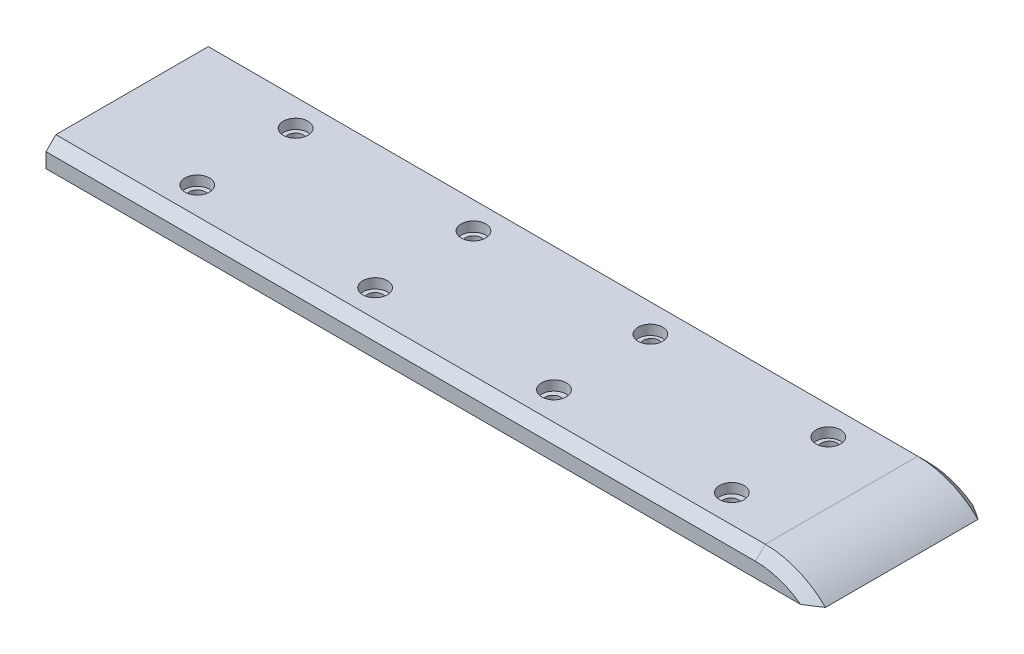
ISO-10303-21;
HEADER;
FILE_DESCRIPTION(('STEP AP214'),'2;1');
FILE_NAME('part.step','',(''),(''),'','','');
FILE_SCHEMA(('AUTOMOTIVE_DESIGN { 1 0 10303 214 1 1 1 1 }'));
ENDSEC;
DATA;
#1=APPLICATION_CONTEXT('core data for automotive mechanical design processes');
#2=APPLICATION_PROTOCOL_DEFINITION('international standard','automotive_design',2000,#1);
#3=PRODUCT_CONTEXT('',#1,'mechanical');
#4=PRODUCT('Part','Part','',(#3));
#5=PRODUCT_RELATED_PRODUCT_CATEGORY('part','',(#4));
#6=PRODUCT_DEFINITION_FORMATION('','',#4);
#7=PRODUCT_DEFINITION_CONTEXT('part definition',#1,'design');
#8=PRODUCT_DEFINITION('design','',#6,#7);
#9=PRODUCT_DEFINITION_SHAPE('','',#8);
#10=(LENGTH_UNIT() NAMED_UNIT(*) SI_UNIT(.MILLI.,.METRE.));
#11=(NAMED_UNIT(*) PLANE_ANGLE_UNIT() SI_UNIT($,.RADIAN.));
#12=(NAMED_UNIT(*) SI_UNIT($,.STERADIAN.) SOLID_ANGLE_UNIT());
#13=UNCERTAINTY_MEASURE_WITH_UNIT(LENGTH_MEASURE(1.E-05),#10,'distance_accuracy_value','');
#14=(GEOMETRIC_REPRESENTATION_CONTEXT(3) GLOBAL_UNCERTAINTY_ASSIGNED_CONTEXT((#13)) GLOBAL_UNIT_ASSIGNED_CONTEXT((#10,
#11,#12)) REPRESENTATION_CONTEXT('',''));
#15=CARTESIAN_POINT('',(0.,0.,0.));
#16=DIRECTION('',(0.,0.,1.));
#17=DIRECTION('',(1.,0.,0.));
#18=AXIS2_PLACEMENT_3D('',#15,#16,#17);
#19=CARTESIAN_POINT('',(62.5000000000001,22.0961940777126,10.));
#20=DIRECTION('',(0.,-1.,0.));
#21=DIRECTION('',(1.,0.,0.));
#22=AXIS2_PLACEMENT_3D('',#19,#20,#21);
#23=CYLINDRICAL_SURFACE('',#22,1.625);
#24=CARTESIAN_POINT('',(62.5000000000001,12.5,10.));
#25=DIRECTION('',(0.,1.,0.));
#26=DIRECTION('',(1.,0.,0.));
#27=AXIS2_PLACEMENT_3D('',#24,#25,#26);
#28=CIRCLE('',#27,1.625);
#29=CARTESIAN_POINT('',(64.1250000000001,12.5,10.));
#30=VERTEX_POINT('',#29);
#31=EDGE_CURVE('E155',#30,#30,#28,.T.);
#32=ORIENTED_EDGE('',*,*,#31,.F.);
#33=EDGE_LOOP('',(#32));
#34=FACE_BOUND('',#33,.T.);
#35=CARTESIAN_POINT('',(62.5000000000001,15.5,10.));
#36=DIRECTION('',(0.,1.,0.));
#37=DIRECTION('',(-1.,0.,0.));
#38=AXIS2_PLACEMENT_3D('',#35,#36,#37);
#39=CIRCLE('',#38,1.625);
#40=CARTESIAN_POINT('',(60.8750000000001,15.5,10.));
#41=VERTEX_POINT('',#40);
#42=EDGE_CURVE('E152',#41,#41,#39,.T.);
#43=ORIENTED_EDGE('',*,*,#42,.T.);
#44=EDGE_LOOP('',(#43));
#45=FACE_BOUND('',#44,.T.);
#46=ADVANCED_FACE('F37',(#34,#45),#23,.F.);
#47=CARTESIAN_POINT('',(26.3333333333334,22.0961940777126,9.99999999999997));
#48=DIRECTION('',(0.,-1.,0.));
#49=DIRECTION('',(1.,0.,0.));
#50=AXIS2_PLACEMENT_3D('',#47,#48,#49);
#51=CYLINDRICAL_SURFACE('',#50,1.625);
#52=CARTESIAN_POINT('',(26.3333333333334,12.5,9.99999999999997));
#53=DIRECTION('',(0.,1.,0.));
#54=DIRECTION('',(1.,0.,0.));
#55=AXIS2_PLACEMENT_3D('',#52,#53,#54);
#56=CIRCLE('',#55,1.625);
#57=CARTESIAN_POINT('',(27.9583333333334,12.5,9.99999999999997));
#58=VERTEX_POINT('',#57);
#59=EDGE_CURVE('E374',#58,#58,#56,.T.);
#60=ORIENTED_EDGE('',*,*,#59,.F.);
#61=EDGE_LOOP('',(#60));
#62=FACE_BOUND('',#61,.T.);
#63=CARTESIAN_POINT('',(26.3333333333334,15.5,9.99999999999997));
#64=DIRECTION('',(0.,1.,0.));
#65=DIRECTION('',(-1.,0.,0.));
#66=AXIS2_PLACEMENT_3D('',#63,#64,#65);
#67=CIRCLE('',#66,1.625);
#68=CARTESIAN_POINT('',(24.7083333333334,15.5,9.99999999999997));
#69=VERTEX_POINT('',#68);
#70=EDGE_CURVE('E149',#69,#69,#67,.T.);
#71=ORIENTED_EDGE('',*,*,#70,.T.);
#72=EDGE_LOOP('',(#71));
#73=FACE_BOUND('',#72,.T.);
#74=ADVANCED_FACE('F213',(#62,#73),#51,.F.);
#75=CARTESIAN_POINT('',(-9.83333333333332,22.0961940777126,10.));
#76=DIRECTION('',(0.,-1.,0.));
#77=DIRECTION('',(1.,0.,0.));
#78=AXIS2_PLACEMENT_3D('',#75,#76,#77);
#79=CYLINDRICAL_SURFACE('',#78,1.625);
#80=CARTESIAN_POINT('',(-9.83333333333332,12.5,10.));
#81=DIRECTION('',(0.,1.,0.));
#82=DIRECTION('',(1.,0.,0.));
#83=AXIS2_PLACEMENT_3D('',#80,#81,#82);
#84=CIRCLE('',#83,1.625);
#85=CARTESIAN_POINT('',(-8.20833333333332,12.5,10.));
#86=VERTEX_POINT('',#85);
#87=EDGE_CURVE('E377',#86,#86,#84,.T.);
#88=ORIENTED_EDGE('',*,*,#87,.F.);
#89=EDGE_LOOP('',(#88));
#90=FACE_BOUND('',#89,.T.);
#91=CARTESIAN_POINT('',(-9.83333333333332,15.5,10.));
#92=DIRECTION('',(0.,1.,0.));
#93=DIRECTION('',(-1.,0.,0.));
#94=AXIS2_PLACEMENT_3D('',#91,#92,#93);
#95=CIRCLE('',#94,1.625);
#96=CARTESIAN_POINT('',(-11.4583333333333,15.5,10.));
#97=VERTEX_POINT('',#96);
#98=EDGE_CURVE('E145',#97,#97,#95,.T.);
#99=ORIENTED_EDGE('',*,*,#98,.T.);
#100=EDGE_LOOP('',(#99));
#101=FACE_BOUND('',#100,.T.);
#102=ADVANCED_FACE('F219',(#90,#101),#79,.F.);
#103=CARTESIAN_POINT('',(-46.,22.0961940777126,10.));
#104=DIRECTION('',(0.,-1.,0.));
#105=DIRECTION('',(1.,0.,0.));
#106=AXIS2_PLACEMENT_3D('',#103,#104,#105);
#107=CYLINDRICAL_SURFACE('',#106,1.625);
#108=CARTESIAN_POINT('',(-46.,12.5,10.));
#109=DIRECTION('',(0.,1.,0.));
#110=DIRECTION('',(1.,0.,0.));
#111=AXIS2_PLACEMENT_3D('',#108,#109,#110);
#112=CIRCLE('',#111,1.625);
#113=CARTESIAN_POINT('',(-44.375,12.5,10.));
#114=VERTEX_POINT('',#113);
#115=EDGE_CURVE('E358',#114,#114,#112,.T.);
#116=ORIENTED_EDGE('',*,*,#115,.F.);
#117=EDGE_LOOP('',(#116));
#118=FACE_BOUND('',#117,.T.);
#119=CARTESIAN_POINT('',(-46.,15.5,10.));
#120=DIRECTION('',(0.,1.,0.));
#121=DIRECTION('',(-1.,0.,0.));
#122=AXIS2_PLACEMENT_3D('',#119,#120,#121);
#123=CIRCLE('',#122,1.625);
#124=CARTESIAN_POINT('',(-47.625,15.5,10.));
#125=VERTEX_POINT('',#124);
#126=EDGE_CURVE('E142',#125,#125,#123,.T.);
#127=ORIENTED_EDGE('',*,*,#126,.T.);
#128=EDGE_LOOP('',(#127));
#129=FACE_BOUND('',#128,.T.);
#130=ADVANCED_FACE('F273',(#118,#129),#107,.F.);
#131=CARTESIAN_POINT('',(62.5000000000001,22.0961940777126,-10.));
#132=DIRECTION('',(0.,-1.,0.));
#133=DIRECTION('',(1.,0.,0.));
#134=AXIS2_PLACEMENT_3D('',#131,#132,#133);
#135=CYLINDRICAL_SURFACE('',#134,1.625);
#136=CARTESIAN_POINT('',(62.5000000000001,12.5,-10.));
#137=DIRECTION('',(0.,-1.,0.));
#138=DIRECTION('',(1.,0.,0.));
#139=AXIS2_PLACEMENT_3D('',#136,#137,#138);
#140=CIRCLE('',#139,1.625);
#141=CARTESIAN_POINT('',(64.1250000000001,12.5,-10.));
#142=VERTEX_POINT('',#141);
#143=EDGE_CURVE('E141',#142,#142,#140,.T.);
#144=ORIENTED_EDGE('',*,*,#143,.T.);
#145=EDGE_LOOP('',(#144));
#146=FACE_BOUND('',#145,.T.);
#147=CARTESIAN_POINT('',(62.5000000000001,15.5,-10.));
#148=DIRECTION('',(0.,1.,0.));
#149=DIRECTION('',(-1.,0.,0.));
#150=AXIS2_PLACEMENT_3D('',#147,#148,#149);
#151=CIRCLE('',#150,1.625);
#152=CARTESIAN_POINT('',(60.8750000000001,15.5,-10.));
#153=VERTEX_POINT('',#152);
#154=EDGE_CURVE('E138',#153,#153,#151,.F.);
#155=ORIENTED_EDGE('',*,*,#154,.F.);
#156=EDGE_LOOP('',(#155));
#157=FACE_BOUND('',#156,.T.);
#158=ADVANCED_FACE('F269',(#146,#157),#135,.F.);
#159=CARTESIAN_POINT('',(26.3333333333334,22.0961940777126,-9.99999999999997));
#160=DIRECTION('',(0.,-1.,0.));
#161=DIRECTION('',(1.,0.,0.));
#162=AXIS2_PLACEMENT_3D('',#159,#160,#161);
#163=CYLINDRICAL_SURFACE('',#162,1.625);
#164=CARTESIAN_POINT('',(26.3333333333334,12.5,-9.99999999999997));
#165=DIRECTION('',(0.,-1.,0.));
#166=DIRECTION('',(1.,0.,0.));
#167=AXIS2_PLACEMENT_3D('',#164,#165,#166);
#168=CIRCLE('',#167,1.625);
#169=CARTESIAN_POINT('',(27.9583333333334,12.5,-9.99999999999997));
#170=VERTEX_POINT('',#169);
#171=EDGE_CURVE('E351',#170,#170,#168,.T.);
#172=ORIENTED_EDGE('',*,*,#171,.T.);
#173=EDGE_LOOP('',(#172));
#174=FACE_BOUND('',#173,.T.);
#175=CARTESIAN_POINT('',(26.3333333333334,15.5,-9.99999999999997));
#176=DIRECTION('',(0.,1.,0.));
#177=DIRECTION('',(-1.,0.,0.));
#178=AXIS2_PLACEMENT_3D('',#175,#176,#177);
#179=CIRCLE('',#178,1.625);
#180=CARTESIAN_POINT('',(24.7083333333334,15.5,-9.99999999999997));
#181=VERTEX_POINT('',#180);
#182=EDGE_CURVE('E135',#181,#181,#179,.F.);
#183=ORIENTED_EDGE('',*,*,#182,.F.);
#184=EDGE_LOOP('',(#183));
#185=FACE_BOUND('',#184,.T.);
#186=ADVANCED_FACE('F265',(#174,#185),#163,.F.);
#187=CARTESIAN_POINT('',(-9.83333333333332,22.0961940777126,-10.));
#188=DIRECTION('',(0.,-1.,0.));
#189=DIRECTION('',(1.,0.,0.));
#190=AXIS2_PLACEMENT_3D('',#187,#188,#189);
#191=CYLINDRICAL_SURFACE('',#190,1.625);
#192=CARTESIAN_POINT('',(-9.83333333333332,12.5,-10.));
#193=DIRECTION('',(0.,-1.,0.));
#194=DIRECTION('',(1.,0.,0.));
#195=AXIS2_PLACEMENT_3D('',#192,#193,#194);
#196=CIRCLE('',#195,1.625);
#197=CARTESIAN_POINT('',(-8.20833333333332,12.5,-10.));
#198=VERTEX_POINT('',#197);
#199=EDGE_CURVE('E346',#198,#198,#196,.T.);
#200=ORIENTED_EDGE('',*,*,#199,.T.);
#201=EDGE_LOOP('',(#200));
#202=FACE_BOUND('',#201,.T.);
#203=CARTESIAN_POINT('',(-9.83333333333332,15.5,-10.));
#204=DIRECTION('',(0.,1.,0.));
#205=DIRECTION('',(-1.,0.,0.));
#206=AXIS2_PLACEMENT_3D('',#203,#204,#205);
#207=CIRCLE('',#206,1.625);
#208=CARTESIAN_POINT('',(-11.4583333333333,15.5,-10.));
#209=VERTEX_POINT('',#208);
#210=EDGE_CURVE('E131',#209,#209,#207,.F.);
#211=ORIENTED_EDGE('',*,*,#210,.F.);
#212=EDGE_LOOP('',(#211));
#213=FACE_BOUND('',#212,.T.);
#214=ADVANCED_FACE('F261',(#202,#213),#191,.F.);
#215=CARTESIAN_POINT('',(-46.,22.0961940777126,-10.));
#216=DIRECTION('',(0.,-1.,0.));
#217=DIRECTION('',(1.,0.,0.));
#218=AXIS2_PLACEMENT_3D('',#215,#216,#217);
#219=CYLINDRICAL_SURFACE('',#218,1.625);
#220=CARTESIAN_POINT('',(-46.,12.5,-10.));
#221=DIRECTION('',(0.,-1.,0.));
#222=DIRECTION('',(1.,0.,0.));
#223=AXIS2_PLACEMENT_3D('',#220,#221,#222);
#224=CIRCLE('',#223,1.625);
#225=CARTESIAN_POINT('',(-44.375,12.5,-10.));
#226=VERTEX_POINT('',#225);
#227=EDGE_CURVE('E343',#226,#226,#224,.T.);
#228=ORIENTED_EDGE('',*,*,#227,.T.);
#229=EDGE_LOOP('',(#228));
#230=FACE_BOUND('',#229,.T.);
#231=CARTESIAN_POINT('',(-46.,15.5,-10.));
#232=DIRECTION('',(0.,1.,0.));
#233=DIRECTION('',(-1.,0.,0.));
#234=AXIS2_PLACEMENT_3D('',#231,#232,#233);
#235=CIRCLE('',#234,1.625);
#236=CARTESIAN_POINT('',(-47.625,15.5,-10.));
#237=VERTEX_POINT('',#236);
#238=EDGE_CURVE('E128',#237,#237,#235,.F.);
#239=ORIENTED_EDGE('',*,*,#238,.F.);
#240=EDGE_LOOP('',(#239));
#241=FACE_BOUND('',#240,.T.);
#242=ADVANCED_FACE('F187',(#230,#241),#219,.F.);
#243=CARTESIAN_POINT('',(87.2474487139159,12.5,17.5));
#244=DIRECTION('',(0.,1.,0.));
#245=DIRECTION('',(-1.,0.,0.));
#246=AXIS2_PLACEMENT_3D('',#243,#244,#245);
#247=PLANE('',#246);
#248=ORIENTED_EDGE('',*,*,#115,.T.);
#249=EDGE_LOOP('',(#248));
#250=FACE_BOUND('',#249,.T.);
#251=ORIENTED_EDGE('',*,*,#87,.T.);
#252=EDGE_LOOP('',(#251));
#253=FACE_BOUND('',#252,.T.);
#254=ORIENTED_EDGE('',*,*,#59,.T.);
#255=EDGE_LOOP('',(#254));
#256=FACE_BOUND('',#255,.T.);
#257=ORIENTED_EDGE('',*,*,#31,.T.);
#258=EDGE_LOOP('',(#257));
#259=FACE_BOUND('',#258,.T.);
#260=ORIENTED_EDGE('',*,*,#227,.F.);
#261=EDGE_LOOP('',(#260));
#262=FACE_BOUND('',#261,.T.);
#263=ORIENTED_EDGE('',*,*,#199,.F.);
#264=EDGE_LOOP('',(#263));
#265=FACE_BOUND('',#264,.T.);
#266=ORIENTED_EDGE('',*,*,#171,.F.);
#267=EDGE_LOOP('',(#266));
#268=FACE_BOUND('',#267,.T.);
#269=ORIENTED_EDGE('',*,*,#143,.F.);
#270=EDGE_LOOP('',(#269));
#271=FACE_BOUND('',#270,.T.);
#272=DIRECTION('',(0.,0.,-1.));
#273=VECTOR('',#272,1.);
#274=CARTESIAN_POINT('',(87.2474487139159,12.5,17.5));
#275=LINE('',#274,#273);
#276=CARTESIAN_POINT('',(87.2474487139159,12.5,15.5));
#277=VERTEX_POINT('',#276);
#278=CARTESIAN_POINT('',(87.2474487139159,12.5,-15.5));
#279=VERTEX_POINT('',#278);
#280=EDGE_CURVE('E124',#277,#279,#275,.T.);
#281=ORIENTED_EDGE('',*,*,#280,.F.);
#282=CARTESIAN_POINT('',(87.2474487139159,12.5,15.5));
#283=CARTESIAN_POINT('',(86.9964877108866,12.5,15.6756172945295));
#284=CARTESIAN_POINT('',(86.7442419059624,12.5,15.849416953267));
#285=CARTESIAN_POINT('',(86.2369787479366,12.5,16.1927194087836));
#286=CARTESIAN_POINT('',(85.9819624339059,12.5,16.3622237420843));
#287=CARTESIAN_POINT('',(85.4687573416287,12.5,16.6964135222086));
#288=CARTESIAN_POINT('',(85.210568351371,12.5,16.8610986444784));
#289=CARTESIAN_POINT('',(84.6906080472939,12.5,17.1849216002896));
#290=CARTESIAN_POINT('',(84.4288354658246,12.5,17.3440573963148));
#291=CARTESIAN_POINT('',(84.1651513899116,12.5,17.5));
#292=B_SPLINE_CURVE_WITH_KNOTS('',3,(#282,#283,#284,#285,#286,#287,#288,#289,#290,#291),
.UNSPECIFIED.,.F.,.F.,(4,2,2,2,4),(0.,0.918922488747956,1.83751148308623,2.75616219883705,
3.67514673333101),.UNSPECIFIED.);
#293=CARTESIAN_POINT('',(84.1651513899117,12.5,17.5));
#294=VERTEX_POINT('',#293);
#295=EDGE_CURVE('E172',#277,#294,#292,.T.);
#296=ORIENTED_EDGE('',*,*,#295,.T.);
#297=DIRECTION('',(1.,0.,0.));
#298=VECTOR('',#297,1.);
#299=CARTESIAN_POINT('',(87.2474487139159,12.5,17.5));
#300=LINE('',#299,#298);
#301=CARTESIAN_POINT('',(-69.2474487139159,12.5,17.5));
#302=VERTEX_POINT('',#301);
#303=EDGE_CURVE('E112',#302,#294,#300,.T.);
#304=ORIENTED_EDGE('',*,*,#303,.F.);
#305=DIRECTION('',(0.,0.,1.));
#306=VECTOR('',#305,1.);
#307=CARTESIAN_POINT('',(-69.2474487139159,12.5,-17.5));
#308=LINE('',#307,#306);
#309=CARTESIAN_POINT('',(-69.2474487139159,12.5,-17.5));
#310=VERTEX_POINT('',#309);
#311=EDGE_CURVE('E99',#310,#302,#308,.T.);
#312=ORIENTED_EDGE('',*,*,#311,.F.);
#313=DIRECTION('',(1.,0.,0.));
#314=VECTOR('',#313,1.);
#315=CARTESIAN_POINT('',(87.2474487139159,12.5,-17.5));
#316=LINE('',#315,#314);
#317=CARTESIAN_POINT('',(84.1651513899117,12.5,-17.5));
#318=VERTEX_POINT('',#317);
#319=EDGE_CURVE('E109',#310,#318,#316,.T.);
#320=ORIENTED_EDGE('',*,*,#319,.T.);
#321=CARTESIAN_POINT('',(84.1651513899117,12.5,-17.5));
#322=CARTESIAN_POINT('',(84.4288354658246,12.5,-17.3440573963148));
#323=CARTESIAN_POINT('',(84.6906080472939,12.5,-17.1849216002896));
#324=CARTESIAN_POINT('',(85.210568351371,12.5,-16.8610986444784));
#325=CARTESIAN_POINT('',(85.4687573416288,12.5,-16.6964135222086));
#326=CARTESIAN_POINT('',(85.9819624339059,12.5,-16.3622237420843));
#327=CARTESIAN_POINT('',(86.2369787479366,12.5,-16.1927194087836));
#328=CARTESIAN_POINT('',(86.7442419059624,12.5,-15.849416953267));
#329=CARTESIAN_POINT('',(86.9964877108866,12.5,-15.6756172945295));
#330=CARTESIAN_POINT('',(87.2474487139159,12.5,-15.5));
#331=B_SPLINE_CURVE_WITH_KNOTS('',3,(#321,#322,#323,#324,#325,#326,#327,#328,#329,#330),
.UNSPECIFIED.,.F.,.F.,(4,2,2,2,4),(0.,0.91898453449396,1.83763525024477,2.756224244583,
3.67514673333098),.UNSPECIFIED.);
#332=EDGE_CURVE('E165',#318,#279,#331,.T.);
#333=ORIENTED_EDGE('',*,*,#332,.T.);
#334=EDGE_LOOP('',(#281,#296,#304,#312,#320,#333));
#335=FACE_BOUND('',#334,.T.);
#336=ADVANCED_FACE('F108',(#250,#253,#256,#259,#262,#265,#268,#271,#335),#247,.F.);
#337=CARTESIAN_POINT('',(75.,0.,17.5));
#338=DIRECTION('',(0.,0.,-1.));
#339=DIRECTION('',(-1.,0.,0.));
#340=AXIS2_PLACEMENT_3D('',#337,#338,#339);
#341=CYLINDRICAL_SURFACE('',#340,17.5);
#342=DIRECTION('',(0.,0.,-1.));
#343=VECTOR('',#342,1.);
#344=CARTESIAN_POINT('',(75.,17.5,17.5));
#345=LINE('',#344,#343);
#346=CARTESIAN_POINT('',(75.,17.5,15.5));
#347=VERTEX_POINT('',#346);
#348=CARTESIAN_POINT('',(75.,17.5,-15.5));
#349=VERTEX_POINT('',#348);
#350=EDGE_CURVE('E117',#347,#349,#345,.T.);
#351=ORIENTED_EDGE('',*,*,#350,.F.);
#352=CARTESIAN_POINT('',(75.,0.,15.5));
#353=DIRECTION('',(0.,0.,1.));
#354=DIRECTION('',(1.,0.,0.));
#355=AXIS2_PLACEMENT_3D('',#352,#353,#354);
#356=CIRCLE('',#355,17.5);
#357=EDGE_CURVE('E163',#347,#277,#356,.F.);
#358=ORIENTED_EDGE('',*,*,#357,.T.);
#359=ORIENTED_EDGE('',*,*,#280,.T.);
#360=CARTESIAN_POINT('',(75.,0.,-15.5));
#361=DIRECTION('',(0.,0.,1.));
#362=DIRECTION('',(1.,0.,0.));
#363=AXIS2_PLACEMENT_3D('',#360,#361,#362);
#364=CIRCLE('',#363,17.5);
#365=EDGE_CURVE('E160',#279,#349,#364,.T.);
#366=ORIENTED_EDGE('',*,*,#365,.T.);
#367=EDGE_LOOP('',(#351,#358,#359,#366));
#368=FACE_BOUND('',#367,.T.);
#369=ADVANCED_FACE('F186',(#368),#341,.T.);
#370=CARTESIAN_POINT('',(-75.,17.5,17.5));
#371=DIRECTION('',(0.,-1.,0.));
#372=DIRECTION('',(1.,0.,0.));
#373=AXIS2_PLACEMENT_3D('',#370,#371,#372);
#374=PLANE('',#373);
#375=CARTESIAN_POINT('',(62.5,17.5,9.8));
#376=DIRECTION('',(0.,-1.,0.));
#377=DIRECTION('',(-1.,0.,0.));
#378=AXIS2_PLACEMENT_3D('',#375,#376,#377);
#379=CIRCLE('',#378,2.49999999999999);
#380=CARTESIAN_POINT('',(60.,17.5,9.8));
#381=VERTEX_POINT('',#380);
#382=EDGE_CURVE('E292',#381,#381,#379,.T.);
#383=ORIENTED_EDGE('',*,*,#382,.T.);
#384=EDGE_LOOP('',(#383));
#385=FACE_BOUND('',#384,.T.);
#386=CARTESIAN_POINT('',(26.3333333333333,17.5,9.8));
#387=DIRECTION('',(0.,-1.,0.));
#388=DIRECTION('',(-1.,0.,0.));
#389=AXIS2_PLACEMENT_3D('',#386,#387,#388);
#390=CIRCLE('',#389,2.49999999999998);
#391=CARTESIAN_POINT('',(23.8333333333333,17.5,9.8));
#392=VERTEX_POINT('',#391);
#393=EDGE_CURVE('E296',#392,#392,#390,.T.);
#394=ORIENTED_EDGE('',*,*,#393,.T.);
#395=EDGE_LOOP('',(#394));
#396=FACE_BOUND('',#395,.T.);
#397=CARTESIAN_POINT('',(-9.83333333333332,17.5,10.));
#398=DIRECTION('',(0.,-1.,0.));
#399=DIRECTION('',(-1.,0.,0.));
#400=AXIS2_PLACEMENT_3D('',#397,#398,#399);
#401=CIRCLE('',#400,2.49999999999999);
#402=CARTESIAN_POINT('',(-12.3333333333333,17.5,10.));
#403=VERTEX_POINT('',#402);
#404=EDGE_CURVE('E300',#403,#403,#401,.T.);
#405=ORIENTED_EDGE('',*,*,#404,.T.);
#406=EDGE_LOOP('',(#405));
#407=FACE_BOUND('',#406,.T.);
#408=CARTESIAN_POINT('',(-46.,17.5,10.));
#409=DIRECTION('',(0.,-1.,0.));
#410=DIRECTION('',(-1.,0.,0.));
#411=AXIS2_PLACEMENT_3D('',#408,#409,#410);
#412=CIRCLE('',#411,2.49999999999999);
#413=CARTESIAN_POINT('',(-48.5,17.5,10.));
#414=VERTEX_POINT('',#413);
#415=EDGE_CURVE('E304',#414,#414,#412,.T.);
#416=ORIENTED_EDGE('',*,*,#415,.T.);
#417=EDGE_LOOP('',(#416));
#418=FACE_BOUND('',#417,.T.);
#419=CARTESIAN_POINT('',(62.5,17.5,-9.8));
#420=DIRECTION('',(0.,1.,0.));
#421=DIRECTION('',(-1.,0.,0.));
#422=AXIS2_PLACEMENT_3D('',#419,#420,#421);
#423=CIRCLE('',#422,2.49999999999999);
#424=CARTESIAN_POINT('',(60.,17.5,-9.8));
#425=VERTEX_POINT('',#424);
#426=EDGE_CURVE('E308',#425,#425,#423,.T.);
#427=ORIENTED_EDGE('',*,*,#426,.F.);
#428=EDGE_LOOP('',(#427));
#429=FACE_BOUND('',#428,.T.);
#430=CARTESIAN_POINT('',(26.3333333333333,17.5,-9.8));
#431=DIRECTION('',(0.,1.,0.));
#432=DIRECTION('',(-1.,0.,0.));
#433=AXIS2_PLACEMENT_3D('',#430,#431,#432);
#434=CIRCLE('',#433,2.49999999999998);
#435=CARTESIAN_POINT('',(23.8333333333333,17.5,-9.8));
#436=VERTEX_POINT('',#435);
#437=EDGE_CURVE('E312',#436,#436,#434,.T.);
#438=ORIENTED_EDGE('',*,*,#437,.F.);
#439=EDGE_LOOP('',(#438));
#440=FACE_BOUND('',#439,.T.);
#441=CARTESIAN_POINT('',(-9.83333333333332,17.5,-10.));
#442=DIRECTION('',(0.,1.,0.));
#443=DIRECTION('',(-1.,0.,0.));
#444=AXIS2_PLACEMENT_3D('',#441,#442,#443);
#445=CIRCLE('',#444,2.49999999999999);
#446=CARTESIAN_POINT('',(-12.3333333333333,17.5,-10.));
#447=VERTEX_POINT('',#446);
#448=EDGE_CURVE('E316',#447,#447,#445,.T.);
#449=ORIENTED_EDGE('',*,*,#448,.F.);
#450=EDGE_LOOP('',(#449));
#451=FACE_BOUND('',#450,.T.);
#452=CARTESIAN_POINT('',(-46.,17.5,-10.));
#453=DIRECTION('',(0.,1.,0.));
#454=DIRECTION('',(-1.,0.,0.));
#455=AXIS2_PLACEMENT_3D('',#452,#453,#454);
#456=CIRCLE('',#455,2.49999999999999);
#457=CARTESIAN_POINT('',(-48.5,17.5,-10.));
#458=VERTEX_POINT('',#457);
#459=EDGE_CURVE('E320',#458,#458,#456,.T.);
#460=ORIENTED_EDGE('',*,*,#459,.F.);
#461=EDGE_LOOP('',(#460));
#462=FACE_BOUND('',#461,.T.);
#463=DIRECTION('',(0.,0.,1.));
#464=VECTOR('',#463,1.);
#465=CARTESIAN_POINT('',(-69.2474487139159,17.5,-17.5));
#466=LINE('',#465,#464);
#467=CARTESIAN_POINT('',(-69.2474487139159,17.5,-15.5));
#468=VERTEX_POINT('',#467);
#469=CARTESIAN_POINT('',(-69.2474487139159,17.5,15.5));
#470=VERTEX_POINT('',#469);
#471=EDGE_CURVE('E113',#468,#470,#466,.T.);
#472=ORIENTED_EDGE('',*,*,#471,.T.);
#473=DIRECTION('',(1.,0.,0.));
#474=VECTOR('',#473,1.);
#475=CARTESIAN_POINT('',(75.,17.5,15.5));
#476=LINE('',#475,#474);
#477=EDGE_CURVE('E322',#470,#347,#476,.T.);
#478=ORIENTED_EDGE('',*,*,#477,.T.);
#479=ORIENTED_EDGE('',*,*,#350,.T.);
#480=DIRECTION('',(-1.,0.,0.));
#481=VECTOR('',#480,1.);
#482=CARTESIAN_POINT('',(-75.,17.5,-15.5));
#483=LINE('',#482,#481);
#484=EDGE_CURVE('E325',#349,#468,#483,.T.);
#485=ORIENTED_EDGE('',*,*,#484,.T.);
#486=EDGE_LOOP('',(#472,#478,#479,#485));
#487=FACE_BOUND('',#486,.T.);
#488=ADVANCED_FACE('F280',(#385,#396,#407,#418,#429,#440,#451,#462,#487),#374,.F.);
#489=CARTESIAN_POINT('',(-75.,0.,17.5));
#490=DIRECTION('',(0.,0.,1.));
#491=DIRECTION('',(1.,0.,0.));
#492=AXIS2_PLACEMENT_3D('',#489,#490,#491);
#493=PLANE('',#492);
#494=ORIENTED_EDGE('',*,*,#303,.T.);
#495=CARTESIAN_POINT('',(75.,0.,17.5));
#496=DIRECTION('',(0.,0.,1.));
#497=DIRECTION('',(1.,0.,0.));
#498=AXIS2_PLACEMENT_3D('',#495,#496,#497);
#499=CIRCLE('',#498,15.5);
#500=CARTESIAN_POINT('',(75.,15.5,17.5));
#501=VERTEX_POINT('',#500);
#502=EDGE_CURVE('E157',#294,#501,#499,.T.);
#503=ORIENTED_EDGE('',*,*,#502,.T.);
#504=DIRECTION('',(-1.,0.,0.));
#505=VECTOR('',#504,1.);
#506=CARTESIAN_POINT('',(-69.2474487139159,15.5,17.5));
#507=LINE('',#506,#505);
#508=CARTESIAN_POINT('',(-69.2474487139159,15.5,17.5));
#509=VERTEX_POINT('',#508);
#510=EDGE_CURVE('E127',#501,#509,#507,.T.);
#511=ORIENTED_EDGE('',*,*,#510,.T.);
#512=DIRECTION('',(0.,1.,0.));
#513=VECTOR('',#512,1.);
#514=CARTESIAN_POINT('',(-69.2474487139159,12.5,17.5));
#515=LINE('',#514,#513);
#516=EDGE_CURVE('E102',#302,#509,#515,.T.);
#517=ORIENTED_EDGE('',*,*,#516,.F.);
#518=EDGE_LOOP('',(#494,#503,#511,#517));
#519=FACE_BOUND('',#518,.T.);
#520=ADVANCED_FACE('F277',(#519),#493,.T.);
#521=CARTESIAN_POINT('',(-75.,0.,-17.5));
#522=DIRECTION('',(0.,0.,1.));
#523=DIRECTION('',(1.,0.,0.));
#524=AXIS2_PLACEMENT_3D('',#521,#522,#523);
#525=PLANE('',#524);
#526=DIRECTION('',(1.,0.,0.));
#527=VECTOR('',#526,1.);
#528=CARTESIAN_POINT('',(-75.,15.5,-17.5));
#529=LINE('',#528,#527);
#530=CARTESIAN_POINT('',(-69.2474487139159,15.5,-17.5));
#531=VERTEX_POINT('',#530);
#532=CARTESIAN_POINT('',(75.,15.5,-17.5));
#533=VERTEX_POINT('',#532);
#534=EDGE_CURVE('E47',#531,#533,#529,.T.);
#535=ORIENTED_EDGE('',*,*,#534,.T.);
#536=CARTESIAN_POINT('',(75.,0.,-17.5));
#537=DIRECTION('',(0.,0.,1.));
#538=DIRECTION('',(1.,0.,0.));
#539=AXIS2_PLACEMENT_3D('',#536,#537,#538);
#540=CIRCLE('',#539,15.5);
#541=EDGE_CURVE('E11',#533,#318,#540,.F.);
#542=ORIENTED_EDGE('',*,*,#541,.T.);
#543=ORIENTED_EDGE('',*,*,#319,.F.);
#544=DIRECTION('',(0.,1.,0.));
#545=VECTOR('',#544,1.);
#546=CARTESIAN_POINT('',(-69.2474487139159,12.5,-17.5));
#547=LINE('',#546,#545);
#548=EDGE_CURVE('E95',#310,#531,#547,.T.);
#549=ORIENTED_EDGE('',*,*,#548,.T.);
#550=EDGE_LOOP('',(#535,#542,#543,#549));
#551=FACE_BOUND('',#550,.T.);
#552=ADVANCED_FACE('F115',(#551),#525,.F.);
#553=CARTESIAN_POINT('',(-69.2474487139159,12.5,-17.5));
#554=DIRECTION('',(1.,0.,0.));
#555=DIRECTION('',(0.,0.,-1.));
#556=AXIS2_PLACEMENT_3D('',#553,#554,#555);
#557=PLANE('',#556);
#558=ORIENTED_EDGE('',*,*,#516,.T.);
#559=DIRECTION('',(0.,0.707106781186545,-0.70710678118655));
#560=VECTOR('',#559,1.);
#561=CARTESIAN_POINT('',(-69.2474487139159,15.5,17.5));
#562=LINE('',#561,#560);
#563=EDGE_CURVE('E328',#509,#470,#562,.T.);
#564=ORIENTED_EDGE('',*,*,#563,.T.);
#565=ORIENTED_EDGE('',*,*,#471,.F.);
#566=DIRECTION('',(0.,0.70710678118655,0.707106781186545));
#567=VECTOR('',#566,1.);
#568=CARTESIAN_POINT('',(-69.2474487139159,17.5,-15.5));
#569=LINE('',#568,#567);
#570=EDGE_CURVE('E61',#468,#531,#569,.F.);
#571=ORIENTED_EDGE('',*,*,#570,.T.);
#572=ORIENTED_EDGE('',*,*,#548,.F.);
#573=ORIENTED_EDGE('',*,*,#311,.T.);
#574=EDGE_LOOP('',(#558,#564,#565,#571,#572,#573));
#575=FACE_BOUND('',#574,.T.);
#576=ADVANCED_FACE('F98',(#575),#557,.F.);
#577=CARTESIAN_POINT('',(-46.,15.5,-10.));
#578=DIRECTION('',(0.,1.,0.));
#579=DIRECTION('',(-1.,0.,0.));
#580=AXIS2_PLACEMENT_3D('',#577,#578,#579);
#581=PLANE('',#580);
#582=CARTESIAN_POINT('',(-46.,15.5,-10.));
#583=DIRECTION('',(0.,1.,0.));
#584=DIRECTION('',(-1.,0.,0.));
#585=AXIS2_PLACEMENT_3D('',#582,#583,#584);
#586=CIRCLE('',#585,2.49999999999999);
#587=CARTESIAN_POINT('',(-48.5,15.5,-10.));
#588=VERTEX_POINT('',#587);
#589=EDGE_CURVE('E357',#588,#588,#586,.T.);
#590=ORIENTED_EDGE('',*,*,#589,.T.);
#591=EDGE_LOOP('',(#590));
#592=FACE_BOUND('',#591,.T.);
#593=ORIENTED_EDGE('',*,*,#238,.T.);
#594=EDGE_LOOP('',(#593));
#595=FACE_BOUND('',#594,.T.);
#596=ADVANCED_FACE('F252',(#592,#595),#581,.T.);
#597=CARTESIAN_POINT('',(-46.,15.5,-10.));
#598=DIRECTION('',(0.,1.,0.));
#599=DIRECTION('',(-1.,0.,0.));
#600=AXIS2_PLACEMENT_3D('',#597,#598,#599);
#601=CYLINDRICAL_SURFACE('',#600,2.49999999999999);
#602=ORIENTED_EDGE('',*,*,#589,.F.);
#603=EDGE_LOOP('',(#602));
#604=FACE_BOUND('',#603,.T.);
#605=ORIENTED_EDGE('',*,*,#459,.T.);
#606=EDGE_LOOP('',(#605));
#607=FACE_BOUND('',#606,.T.);
#608=ADVANCED_FACE('F247',(#604,#607),#601,.F.);
#609=CARTESIAN_POINT('',(-9.83333333333332,15.5,-10.));
#610=DIRECTION('',(0.,1.,0.));
#611=DIRECTION('',(-1.,0.,0.));
#612=AXIS2_PLACEMENT_3D('',#609,#610,#611);
#613=PLANE('',#612);
#614=CARTESIAN_POINT('',(-9.83333333333332,15.5,-10.));
#615=DIRECTION('',(0.,1.,0.));
#616=DIRECTION('',(-1.,0.,0.));
#617=AXIS2_PLACEMENT_3D('',#614,#615,#616);
#618=CIRCLE('',#617,2.49999999999999);
#619=CARTESIAN_POINT('',(-12.3333333333333,15.5,-10.));
#620=VERTEX_POINT('',#619);
#621=EDGE_CURVE('E362',#620,#620,#618,.T.);
#622=ORIENTED_EDGE('',*,*,#621,.T.);
#623=EDGE_LOOP('',(#622));
#624=FACE_BOUND('',#623,.T.);
#625=ORIENTED_EDGE('',*,*,#210,.T.);
#626=EDGE_LOOP('',(#625));
#627=FACE_BOUND('',#626,.T.);
#628=ADVANCED_FACE('F244',(#624,#627),#613,.T.);
#629=CARTESIAN_POINT('',(-9.83333333333332,15.5,-10.));
#630=DIRECTION('',(0.,1.,0.));
#631=DIRECTION('',(-1.,0.,0.));
#632=AXIS2_PLACEMENT_3D('',#629,#630,#631);
#633=CYLINDRICAL_SURFACE('',#632,2.49999999999999);
#634=ORIENTED_EDGE('',*,*,#621,.F.);
#635=EDGE_LOOP('',(#634));
#636=FACE_BOUND('',#635,.T.);
#637=ORIENTED_EDGE('',*,*,#448,.T.);
#638=EDGE_LOOP('',(#637));
#639=FACE_BOUND('',#638,.T.);
#640=ADVANCED_FACE('F239',(#636,#639),#633,.F.);
#641=CARTESIAN_POINT('',(26.3333333333333,15.5,-9.8));
#642=DIRECTION('',(0.,1.,0.));
#643=DIRECTION('',(-1.,0.,0.));
#644=AXIS2_PLACEMENT_3D('',#641,#642,#643);
#645=PLANE('',#644);
#646=CARTESIAN_POINT('',(26.3333333333333,15.5,-9.8));
#647=DIRECTION('',(0.,1.,0.));
#648=DIRECTION('',(-1.,0.,0.));
#649=AXIS2_PLACEMENT_3D('',#646,#647,#648);
#650=CIRCLE('',#649,2.49999999999998);
#651=CARTESIAN_POINT('',(23.8333333333333,15.5,-9.8));
#652=VERTEX_POINT('',#651);
#653=EDGE_CURVE('E366',#652,#652,#650,.T.);
#654=ORIENTED_EDGE('',*,*,#653,.T.);
#655=EDGE_LOOP('',(#654));
#656=FACE_BOUND('',#655,.T.);
#657=ORIENTED_EDGE('',*,*,#182,.T.);
#658=EDGE_LOOP('',(#657));
#659=FACE_BOUND('',#658,.T.);
#660=ADVANCED_FACE('F236',(#656,#659),#645,.T.);
#661=CARTESIAN_POINT('',(26.3333333333333,15.5,-9.8));
#662=DIRECTION('',(0.,1.,0.));
#663=DIRECTION('',(-1.,0.,0.));
#664=AXIS2_PLACEMENT_3D('',#661,#662,#663);
#665=CYLINDRICAL_SURFACE('',#664,2.49999999999998);
#666=ORIENTED_EDGE('',*,*,#653,.F.);
#667=EDGE_LOOP('',(#666));
#668=FACE_BOUND('',#667,.T.);
#669=ORIENTED_EDGE('',*,*,#437,.T.);
#670=EDGE_LOOP('',(#669));
#671=FACE_BOUND('',#670,.T.);
#672=ADVANCED_FACE('F230',(#668,#671),#665,.F.);
#673=CARTESIAN_POINT('',(62.5,15.5,-9.8));
#674=DIRECTION('',(0.,1.,0.));
#675=DIRECTION('',(-1.,0.,0.));
#676=AXIS2_PLACEMENT_3D('',#673,#674,#675);
#677=PLANE('',#676);
#678=CARTESIAN_POINT('',(62.5,15.5,-9.8));
#679=DIRECTION('',(0.,1.,0.));
#680=DIRECTION('',(-1.,0.,0.));
#681=AXIS2_PLACEMENT_3D('',#678,#679,#680);
#682=CIRCLE('',#681,2.49999999999999);
#683=CARTESIAN_POINT('',(60.,15.5,-9.8));
#684=VERTEX_POINT('',#683);
#685=EDGE_CURVE('E132',#684,#684,#682,.T.);
#686=ORIENTED_EDGE('',*,*,#685,.T.);
#687=EDGE_LOOP('',(#686));
#688=FACE_BOUND('',#687,.T.);
#689=ORIENTED_EDGE('',*,*,#154,.T.);
#690=EDGE_LOOP('',(#689));
#691=FACE_BOUND('',#690,.T.);
#692=ADVANCED_FACE('F226',(#688,#691),#677,.T.);
#693=CARTESIAN_POINT('',(62.5,15.5,-9.8));
#694=DIRECTION('',(0.,1.,0.));
#695=DIRECTION('',(-1.,0.,0.));
#696=AXIS2_PLACEMENT_3D('',#693,#694,#695);
#697=CYLINDRICAL_SURFACE('',#696,2.49999999999999);
#698=ORIENTED_EDGE('',*,*,#685,.F.);
#699=EDGE_LOOP('',(#698));
#700=FACE_BOUND('',#699,.T.);
#701=ORIENTED_EDGE('',*,*,#426,.T.);
#702=EDGE_LOOP('',(#701));
#703=FACE_BOUND('',#702,.T.);
#704=ADVANCED_FACE('F229',(#700,#703),#697,.F.);
#705=CARTESIAN_POINT('',(-46.,15.5,10.));
#706=DIRECTION('',(0.,1.,0.));
#707=DIRECTION('',(-1.,0.,0.));
#708=AXIS2_PLACEMENT_3D('',#705,#706,#707);
#709=CYLINDRICAL_SURFACE('',#708,2.49999999999999);
#710=CARTESIAN_POINT('',(-46.,15.5,10.));
#711=DIRECTION('',(0.,-1.,0.));
#712=DIRECTION('',(-1.,0.,0.));
#713=AXIS2_PLACEMENT_3D('',#710,#711,#712);
#714=CIRCLE('',#713,2.49999999999999);
#715=CARTESIAN_POINT('',(-48.5,15.5,10.));
#716=VERTEX_POINT('',#715);
#717=EDGE_CURVE('E336',#716,#716,#714,.T.);
#718=ORIENTED_EDGE('',*,*,#717,.T.);
#719=EDGE_LOOP('',(#718));
#720=FACE_BOUND('',#719,.T.);
#721=ORIENTED_EDGE('',*,*,#415,.F.);
#722=EDGE_LOOP('',(#721));
#723=FACE_BOUND('',#722,.T.);
#724=ADVANCED_FACE('F234',(#720,#723),#709,.F.);
#725=CARTESIAN_POINT('',(-46.,15.5,10.));
#726=DIRECTION('',(0.,1.,0.));
#727=DIRECTION('',(-1.,0.,0.));
#728=AXIS2_PLACEMENT_3D('',#725,#726,#727);
#729=PLANE('',#728);
#730=ORIENTED_EDGE('',*,*,#126,.F.);
#731=EDGE_LOOP('',(#730));
#732=FACE_BOUND('',#731,.T.);
#733=ORIENTED_EDGE('',*,*,#717,.F.);
#734=EDGE_LOOP('',(#733));
#735=FACE_BOUND('',#734,.T.);
#736=ADVANCED_FACE('F418',(#732,#735),#729,.T.);
#737=CARTESIAN_POINT('',(-9.83333333333332,15.5,10.));
#738=DIRECTION('',(0.,1.,0.));
#739=DIRECTION('',(-1.,0.,0.));
#740=AXIS2_PLACEMENT_3D('',#737,#738,#739);
#741=CYLINDRICAL_SURFACE('',#740,2.49999999999999);
#742=CARTESIAN_POINT('',(-9.83333333333332,15.5,10.));
#743=DIRECTION('',(0.,-1.,0.));
#744=DIRECTION('',(-1.,0.,0.));
#745=AXIS2_PLACEMENT_3D('',#742,#743,#744);
#746=CIRCLE('',#745,2.49999999999999);
#747=CARTESIAN_POINT('',(-12.3333333333333,15.5,10.));
#748=VERTEX_POINT('',#747);
#749=EDGE_CURVE('E385',#748,#748,#746,.T.);
#750=ORIENTED_EDGE('',*,*,#749,.T.);
#751=EDGE_LOOP('',(#750));
#752=FACE_BOUND('',#751,.T.);
#753=ORIENTED_EDGE('',*,*,#404,.F.);
#754=EDGE_LOOP('',(#753));
#755=FACE_BOUND('',#754,.T.);
#756=ADVANCED_FACE('F414',(#752,#755),#741,.F.);
#757=CARTESIAN_POINT('',(-9.83333333333332,15.5,10.));
#758=DIRECTION('',(0.,1.,0.));
#759=DIRECTION('',(-1.,0.,0.));
#760=AXIS2_PLACEMENT_3D('',#757,#758,#759);
#761=PLANE('',#760);
#762=ORIENTED_EDGE('',*,*,#98,.F.);
#763=EDGE_LOOP('',(#762));
#764=FACE_BOUND('',#763,.T.);
#765=ORIENTED_EDGE('',*,*,#749,.F.);
#766=EDGE_LOOP('',(#765));
#767=FACE_BOUND('',#766,.T.);
#768=ADVANCED_FACE('F410',(#764,#767),#761,.T.);
#769=CARTESIAN_POINT('',(26.3333333333333,15.5,9.8));
#770=DIRECTION('',(0.,1.,0.));
#771=DIRECTION('',(-1.,0.,0.));
#772=AXIS2_PLACEMENT_3D('',#769,#770,#771);
#773=CYLINDRICAL_SURFACE('',#772,2.49999999999998);
#774=CARTESIAN_POINT('',(26.3333333333333,15.5,9.8));
#775=DIRECTION('',(0.,-1.,0.));
#776=DIRECTION('',(-1.,0.,0.));
#777=AXIS2_PLACEMENT_3D('',#774,#775,#776);
#778=CIRCLE('',#777,2.49999999999998);
#779=CARTESIAN_POINT('',(23.8333333333333,15.5,9.8));
#780=VERTEX_POINT('',#779);
#781=EDGE_CURVE('E389',#780,#780,#778,.T.);
#782=ORIENTED_EDGE('',*,*,#781,.T.);
#783=EDGE_LOOP('',(#782));
#784=FACE_BOUND('',#783,.T.);
#785=ORIENTED_EDGE('',*,*,#393,.F.);
#786=EDGE_LOOP('',(#785));
#787=FACE_BOUND('',#786,.T.);
#788=ADVANCED_FACE('F404',(#784,#787),#773,.F.);
#789=CARTESIAN_POINT('',(26.3333333333333,15.5,9.8));
#790=DIRECTION('',(0.,1.,0.));
#791=DIRECTION('',(-1.,0.,0.));
#792=AXIS2_PLACEMENT_3D('',#789,#790,#791);
#793=PLANE('',#792);
#794=ORIENTED_EDGE('',*,*,#70,.F.);
#795=EDGE_LOOP('',(#794));
#796=FACE_BOUND('',#795,.T.);
#797=ORIENTED_EDGE('',*,*,#781,.F.);
#798=EDGE_LOOP('',(#797));
#799=FACE_BOUND('',#798,.T.);
#800=ADVANCED_FACE('F399',(#796,#799),#793,.T.);
#801=CARTESIAN_POINT('',(62.5,15.5,9.8));
#802=DIRECTION('',(0.,1.,0.));
#803=DIRECTION('',(-1.,0.,0.));
#804=AXIS2_PLACEMENT_3D('',#801,#802,#803);
#805=CYLINDRICAL_SURFACE('',#804,2.49999999999999);
#806=CARTESIAN_POINT('',(62.5,15.5,9.8));
#807=DIRECTION('',(0.,-1.,0.));
#808=DIRECTION('',(-1.,0.,0.));
#809=AXIS2_PLACEMENT_3D('',#806,#807,#808);
#810=CIRCLE('',#809,2.49999999999999);
#811=CARTESIAN_POINT('',(60.,15.5,9.8));
#812=VERTEX_POINT('',#811);
#813=EDGE_CURVE('E146',#812,#812,#810,.T.);
#814=ORIENTED_EDGE('',*,*,#813,.T.);
#815=EDGE_LOOP('',(#814));
#816=FACE_BOUND('',#815,.T.);
#817=ORIENTED_EDGE('',*,*,#382,.F.);
#818=EDGE_LOOP('',(#817));
#819=FACE_BOUND('',#818,.T.);
#820=ADVANCED_FACE('F208',(#816,#819),#805,.F.);
#821=CARTESIAN_POINT('',(62.5,15.5,9.8));
#822=DIRECTION('',(0.,1.,0.));
#823=DIRECTION('',(-1.,0.,0.));
#824=AXIS2_PLACEMENT_3D('',#821,#822,#823);
#825=PLANE('',#824);
#826=ORIENTED_EDGE('',*,*,#42,.F.);
#827=EDGE_LOOP('',(#826));
#828=FACE_BOUND('',#827,.T.);
#829=ORIENTED_EDGE('',*,*,#813,.F.);
#830=EDGE_LOOP('',(#829));
#831=FACE_BOUND('',#830,.T.);
#832=ADVANCED_FACE('F203',(#828,#831),#825,.T.);
#833=CARTESIAN_POINT('',(-75.,15.5,17.5));
#834=DIRECTION('',(0.,0.70710678118655,0.707106781186545));
#835=DIRECTION('',(1.,0.,0.));
#836=AXIS2_PLACEMENT_3D('',#833,#834,#835);
#837=PLANE('',#836);
#838=ORIENTED_EDGE('',*,*,#563,.F.);
#839=ORIENTED_EDGE('',*,*,#510,.F.);
#840=DIRECTION('',(0.,-0.707106781186545,0.70710678118655));
#841=VECTOR('',#840,1.);
#842=CARTESIAN_POINT('',(75.,17.5,15.5));
#843=LINE('',#842,#841);
#844=EDGE_CURVE('E329',#347,#501,#843,.T.);
#845=ORIENTED_EDGE('',*,*,#844,.F.);
#846=ORIENTED_EDGE('',*,*,#477,.F.);
#847=EDGE_LOOP('',(#838,#839,#845,#846));
#848=FACE_BOUND('',#847,.T.);
#849=ADVANCED_FACE('F198',(#848),#837,.T.);
#850=CARTESIAN_POINT('',(75.,0.,17.5));
#851=DIRECTION('',(0.,0.,-1.));
#852=DIRECTION('',(-1.,0.,0.));
#853=AXIS2_PLACEMENT_3D('',#850,#851,#852);
#854=CONICAL_SURFACE('',#853,15.5,0.785398163397445);
#855=ORIENTED_EDGE('',*,*,#295,.F.);
#856=ORIENTED_EDGE('',*,*,#357,.F.);
#857=ORIENTED_EDGE('',*,*,#844,.T.);
#858=ORIENTED_EDGE('',*,*,#502,.F.);
#859=EDGE_LOOP('',(#855,#856,#857,#858));
#860=FACE_BOUND('',#859,.T.);
#861=ADVANCED_FACE('F191',(#860),#854,.T.);
#862=CARTESIAN_POINT('',(-75.,17.5,-15.5));
#863=DIRECTION('',(0.,-0.707106781186545,0.70710678118655));
#864=DIRECTION('',(-1.,0.,0.));
#865=AXIS2_PLACEMENT_3D('',#862,#863,#864);
#866=PLANE('',#865);
#867=ORIENTED_EDGE('',*,*,#570,.F.);
#868=ORIENTED_EDGE('',*,*,#484,.F.);
#869=DIRECTION('',(0.,0.70710678118655,0.707106781186545));
#870=VECTOR('',#869,1.);
#871=CARTESIAN_POINT('',(75.,15.5,-17.5));
#872=LINE('',#871,#870);
#873=EDGE_CURVE('E42',#533,#349,#872,.T.);
#874=ORIENTED_EDGE('',*,*,#873,.F.);
#875=ORIENTED_EDGE('',*,*,#534,.F.);
#876=EDGE_LOOP('',(#867,#868,#874,#875));
#877=FACE_BOUND('',#876,.T.);
#878=ADVANCED_FACE('F40',(#877),#866,.F.);
#879=CARTESIAN_POINT('',(75.,0.,-15.5));
#880=DIRECTION('',(0.,0.,1.));
#881=DIRECTION('',(1.,0.,0.));
#882=AXIS2_PLACEMENT_3D('',#879,#880,#881);
#883=CONICAL_SURFACE('',#882,17.5,0.785398163397452);
#884=ORIENTED_EDGE('',*,*,#332,.F.);
#885=ORIENTED_EDGE('',*,*,#541,.F.);
#886=ORIENTED_EDGE('',*,*,#873,.T.);
#887=ORIENTED_EDGE('',*,*,#365,.F.);
#888=EDGE_LOOP('',(#884,#885,#886,#887));
#889=FACE_BOUND('',#888,.T.);
#890=ADVANCED_FACE('F180',(#889),#883,.T.);
#891=CLOSED_SHELL('',(#46,#74,#102,#130,#158,#186,#214,#242,#336,#369,#488,#520,#552,#576,#596,
#608,#628,#640,#660,#672,#692,#704,#724,#736,#756,#768,#788,#800,#820,#832,#849,#861,#878,#890));
#892=MANIFOLD_SOLID_BREP('B2',#891);
#893=ADVANCED_BREP_SHAPE_REPRESENTATION('',(#18,#892),#14);
#894=SHAPE_DEFINITION_REPRESENTATION(#9,#893);
ENDSEC;
END-ISO-10303-21;
